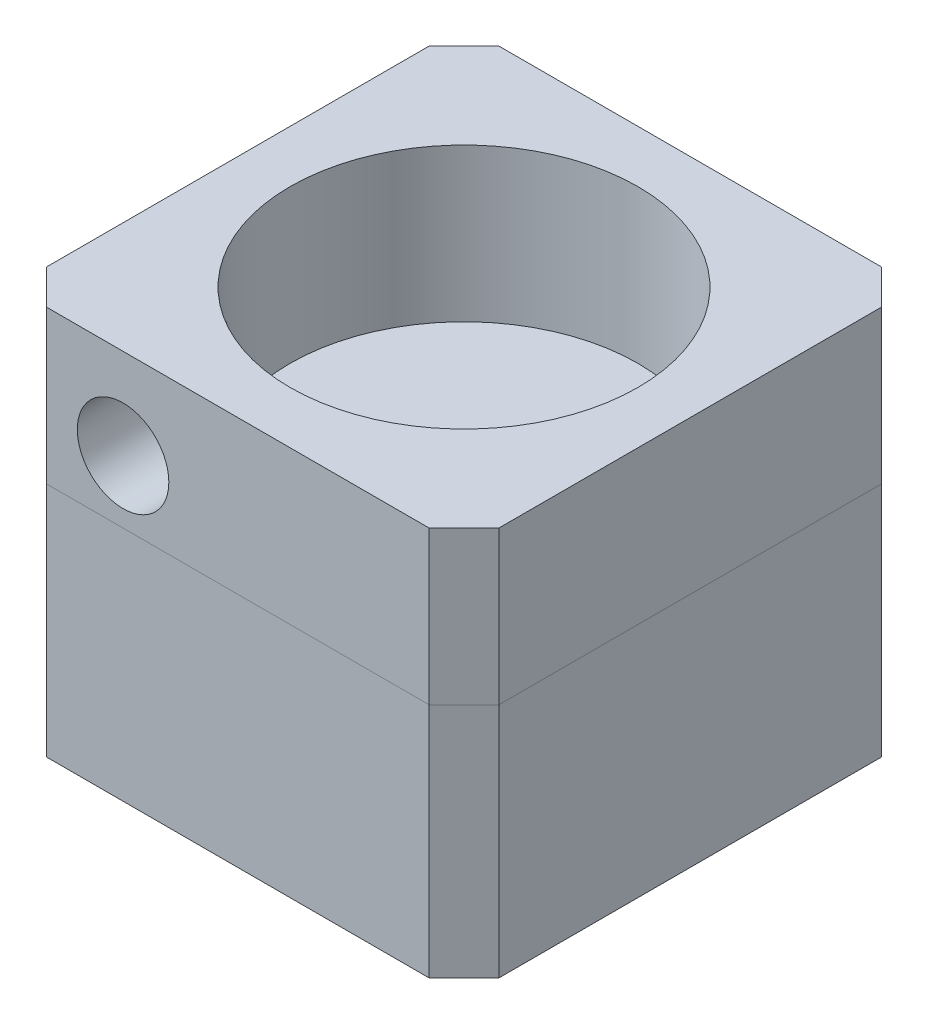
ISO-10303-21;
HEADER;
FILE_DESCRIPTION(('STEP AP214'),'2;1');
FILE_NAME('part.step','',(''),(''),'','','');
FILE_SCHEMA(('AUTOMOTIVE_DESIGN { 1 0 10303 214 1 1 1 1 }'));
ENDSEC;
DATA;
#1=APPLICATION_CONTEXT('core data for automotive mechanical design processes');
#2=APPLICATION_PROTOCOL_DEFINITION('international standard','automotive_design',2000,#1);
#3=PRODUCT_CONTEXT('',#1,'mechanical');
#4=PRODUCT('Part','Part','',(#3));
#5=PRODUCT_RELATED_PRODUCT_CATEGORY('part','',(#4));
#6=PRODUCT_DEFINITION_FORMATION('','',#4);
#7=PRODUCT_DEFINITION_CONTEXT('part definition',#1,'design');
#8=PRODUCT_DEFINITION('design','',#6,#7);
#9=PRODUCT_DEFINITION_SHAPE('','',#8);
#10=(LENGTH_UNIT() NAMED_UNIT(*) SI_UNIT(.MILLI.,.METRE.));
#11=(NAMED_UNIT(*) PLANE_ANGLE_UNIT() SI_UNIT($,.RADIAN.));
#12=(NAMED_UNIT(*) SI_UNIT($,.STERADIAN.) SOLID_ANGLE_UNIT());
#13=UNCERTAINTY_MEASURE_WITH_UNIT(LENGTH_MEASURE(1.E-05),#10,'distance_accuracy_value','');
#14=(GEOMETRIC_REPRESENTATION_CONTEXT(3) GLOBAL_UNCERTAINTY_ASSIGNED_CONTEXT((#13)) GLOBAL_UNIT_ASSIGNED_CONTEXT((#10,
#11,#12)) REPRESENTATION_CONTEXT('',''));
#15=CARTESIAN_POINT('',(0.,0.,0.));
#16=DIRECTION('',(0.,0.,1.));
#17=DIRECTION('',(1.,0.,0.));
#18=AXIS2_PLACEMENT_3D('',#15,#16,#17);
#19=CARTESIAN_POINT('',(32.5,56.,-27.5));
#20=DIRECTION('',(-0.70710678118655,0.,0.707106781186546));
#21=DIRECTION('',(0.707106781186546,0.,0.70710678118655));
#22=AXIS2_PLACEMENT_3D('',#19,#20,#21);
#23=PLANE('',#22);
#24=DIRECTION('',(-0.707106781186545,0.,-0.707106781186549));
#25=VECTOR('',#24,1.);
#26=CARTESIAN_POINT('',(32.5,34.,-27.5));
#27=LINE('',#26,#25);
#28=CARTESIAN_POINT('',(32.5,34.,-27.5));
#29=VERTEX_POINT('',#28);
#30=CARTESIAN_POINT('',(27.5,34.,-32.5));
#31=VERTEX_POINT('',#30);
#32=EDGE_CURVE('E154',#29,#31,#27,.T.);
#33=ORIENTED_EDGE('',*,*,#32,.T.);
#34=DIRECTION('',(0.,-1.,0.));
#35=VECTOR('',#34,1.);
#36=CARTESIAN_POINT('',(27.5,56.,-32.5));
#37=LINE('',#36,#35);
#38=CARTESIAN_POINT('',(27.5,56.,-32.5));
#39=VERTEX_POINT('',#38);
#40=EDGE_CURVE('E56',#39,#31,#37,.T.);
#41=ORIENTED_EDGE('',*,*,#40,.F.);
#42=DIRECTION('',(-0.707106781186545,0.,-0.707106781186549));
#43=VECTOR('',#42,1.);
#44=CARTESIAN_POINT('',(32.5,56.,-27.5));
#45=LINE('',#44,#43);
#46=CARTESIAN_POINT('',(32.5,56.,-27.5));
#47=VERTEX_POINT('',#46);
#48=EDGE_CURVE('E170',#47,#39,#45,.T.);
#49=ORIENTED_EDGE('',*,*,#48,.F.);
#50=DIRECTION('',(0.,-1.,0.));
#51=VECTOR('',#50,1.);
#52=CARTESIAN_POINT('',(32.5,56.,-27.5));
#53=LINE('',#52,#51);
#54=EDGE_CURVE('E150',#47,#29,#53,.T.);
#55=ORIENTED_EDGE('',*,*,#54,.T.);
#56=EDGE_LOOP('',(#33,#41,#49,#55));
#57=FACE_BOUND('',#56,.T.);
#58=ADVANCED_FACE('F49',(#57),#23,.F.);
#59=CARTESIAN_POINT('',(27.5,56.,-32.5));
#60=DIRECTION('',(0.,0.,1.));
#61=DIRECTION('',(1.,0.,0.));
#62=AXIS2_PLACEMENT_3D('',#59,#60,#61);
#63=PLANE('',#62);
#64=DIRECTION('',(-1.,0.,0.));
#65=VECTOR('',#64,1.);
#66=CARTESIAN_POINT('',(27.5,34.,-32.5));
#67=LINE('',#66,#65);
#68=CARTESIAN_POINT('',(-27.5,34.,-32.5));
#69=VERTEX_POINT('',#68);
#70=EDGE_CURVE('E157',#31,#69,#67,.T.);
#71=ORIENTED_EDGE('',*,*,#70,.T.);
#72=DIRECTION('',(0.,-1.,0.));
#73=VECTOR('',#72,1.);
#74=CARTESIAN_POINT('',(-27.5,56.,-32.5));
#75=LINE('',#74,#73);
#76=CARTESIAN_POINT('',(-27.5,56.,-32.5));
#77=VERTEX_POINT('',#76);
#78=EDGE_CURVE('E180',#77,#69,#75,.T.);
#79=ORIENTED_EDGE('',*,*,#78,.F.);
#80=DIRECTION('',(-1.,0.,0.));
#81=VECTOR('',#80,1.);
#82=CARTESIAN_POINT('',(27.5,56.,-32.5));
#83=LINE('',#82,#81);
#84=EDGE_CURVE('E112',#39,#77,#83,.T.);
#85=ORIENTED_EDGE('',*,*,#84,.F.);
#86=ORIENTED_EDGE('',*,*,#40,.T.);
#87=EDGE_LOOP('',(#71,#79,#85,#86));
#88=FACE_BOUND('',#87,.T.);
#89=ADVANCED_FACE('F183',(#88),#63,.F.);
#90=CARTESIAN_POINT('',(-27.5,56.,-32.5));
#91=DIRECTION('',(0.707106781186546,0.,0.70710678118655));
#92=DIRECTION('',(0.70710678118655,0.,-0.707106781186546));
#93=AXIS2_PLACEMENT_3D('',#90,#91,#92);
#94=PLANE('',#93);
#95=DIRECTION('',(-0.707106781186549,0.,0.707106781186545));
#96=VECTOR('',#95,1.);
#97=CARTESIAN_POINT('',(-27.5,34.,-32.5));
#98=LINE('',#97,#96);
#99=CARTESIAN_POINT('',(-32.5,34.,-27.5));
#100=VERTEX_POINT('',#99);
#101=EDGE_CURVE('E160',#69,#100,#98,.T.);
#102=ORIENTED_EDGE('',*,*,#101,.T.);
#103=DIRECTION('',(0.,-1.,0.));
#104=VECTOR('',#103,1.);
#105=CARTESIAN_POINT('',(-32.5,56.,-27.5));
#106=LINE('',#105,#104);
#107=CARTESIAN_POINT('',(-32.5,56.,-27.5));
#108=VERTEX_POINT('',#107);
#109=EDGE_CURVE('E177',#108,#100,#106,.T.);
#110=ORIENTED_EDGE('',*,*,#109,.F.);
#111=DIRECTION('',(-0.707106781186549,0.,0.707106781186545));
#112=VECTOR('',#111,1.);
#113=CARTESIAN_POINT('',(-27.5,56.,-32.5));
#114=LINE('',#113,#112);
#115=EDGE_CURVE('E201',#77,#108,#114,.T.);
#116=ORIENTED_EDGE('',*,*,#115,.F.);
#117=ORIENTED_EDGE('',*,*,#78,.T.);
#118=EDGE_LOOP('',(#102,#110,#116,#117));
#119=FACE_BOUND('',#118,.T.);
#120=ADVANCED_FACE('F194',(#119),#94,.F.);
#121=CARTESIAN_POINT('',(-32.5,56.,-27.5));
#122=DIRECTION('',(1.,0.,0.));
#123=DIRECTION('',(0.,0.,-1.));
#124=AXIS2_PLACEMENT_3D('',#121,#122,#123);
#125=PLANE('',#124);
#126=DIRECTION('',(0.,0.,1.));
#127=VECTOR('',#126,1.);
#128=CARTESIAN_POINT('',(-32.5,34.,-27.5));
#129=LINE('',#128,#127);
#130=CARTESIAN_POINT('',(-32.5,34.,27.5));
#131=VERTEX_POINT('',#130);
#132=EDGE_CURVE('E162',#100,#131,#129,.T.);
#133=ORIENTED_EDGE('',*,*,#132,.T.);
#134=DIRECTION('',(0.,-1.,0.));
#135=VECTOR('',#134,1.);
#136=CARTESIAN_POINT('',(-32.5,56.,27.5));
#137=LINE('',#136,#135);
#138=CARTESIAN_POINT('',(-32.5,56.,27.5));
#139=VERTEX_POINT('',#138);
#140=EDGE_CURVE('E174',#139,#131,#137,.T.);
#141=ORIENTED_EDGE('',*,*,#140,.F.);
#142=DIRECTION('',(0.,0.,1.));
#143=VECTOR('',#142,1.);
#144=CARTESIAN_POINT('',(-32.5,56.,-27.5));
#145=LINE('',#144,#143);
#146=EDGE_CURVE('E200',#108,#139,#145,.T.);
#147=ORIENTED_EDGE('',*,*,#146,.F.);
#148=ORIENTED_EDGE('',*,*,#109,.T.);
#149=EDGE_LOOP('',(#133,#141,#147,#148));
#150=FACE_BOUND('',#149,.T.);
#151=ADVANCED_FACE('F198',(#150),#125,.F.);
#152=CARTESIAN_POINT('',(-32.5,56.,27.5));
#153=DIRECTION('',(0.70710678118655,0.,-0.707106781186546));
#154=DIRECTION('',(-0.707106781186546,0.,-0.70710678118655));
#155=AXIS2_PLACEMENT_3D('',#152,#153,#154);
#156=PLANE('',#155);
#157=DIRECTION('',(0.707106781186545,0.,0.707106781186549));
#158=VECTOR('',#157,1.);
#159=CARTESIAN_POINT('',(-32.5,34.,27.5));
#160=LINE('',#159,#158);
#161=CARTESIAN_POINT('',(-27.5,34.,32.5));
#162=VERTEX_POINT('',#161);
#163=EDGE_CURVE('E164',#131,#162,#160,.T.);
#164=ORIENTED_EDGE('',*,*,#163,.T.);
#165=DIRECTION('',(0.,-1.,0.));
#166=VECTOR('',#165,1.);
#167=CARTESIAN_POINT('',(-27.5,56.,32.5));
#168=LINE('',#167,#166);
#169=CARTESIAN_POINT('',(-27.5,56.,32.5));
#170=VERTEX_POINT('',#169);
#171=EDGE_CURVE('E145',#170,#162,#168,.T.);
#172=ORIENTED_EDGE('',*,*,#171,.F.);
#173=DIRECTION('',(0.707106781186545,0.,0.707106781186549));
#174=VECTOR('',#173,1.);
#175=CARTESIAN_POINT('',(-32.5,56.,27.5));
#176=LINE('',#175,#174);
#177=EDGE_CURVE('E133',#139,#170,#176,.T.);
#178=ORIENTED_EDGE('',*,*,#177,.F.);
#179=ORIENTED_EDGE('',*,*,#140,.T.);
#180=EDGE_LOOP('',(#164,#172,#178,#179));
#181=FACE_BOUND('',#180,.T.);
#182=ADVANCED_FACE('F248',(#181),#156,.F.);
#183=CARTESIAN_POINT('',(-27.5,56.,32.5));
#184=DIRECTION('',(0.,0.,-1.));
#185=DIRECTION('',(-1.,0.,0.));
#186=AXIS2_PLACEMENT_3D('',#183,#184,#185);
#187=PLANE('',#186);
#188=CARTESIAN_POINT('',(-16.5,43.,32.5));
#189=DIRECTION('',(0.,0.,1.));
#190=DIRECTION('',(1.,0.,0.));
#191=AXIS2_PLACEMENT_3D('',#188,#189,#190);
#192=CIRCLE('',#191,6.5785);
#193=CARTESIAN_POINT('',(-9.9215,43.,32.5));
#194=VERTEX_POINT('',#193);
#195=EDGE_CURVE('E207',#194,#194,#192,.T.);
#196=ORIENTED_EDGE('',*,*,#195,.F.);
#197=EDGE_LOOP('',(#196));
#198=FACE_BOUND('',#197,.T.);
#199=DIRECTION('',(1.,0.,0.));
#200=VECTOR('',#199,1.);
#201=CARTESIAN_POINT('',(-27.5,34.,32.5));
#202=LINE('',#201,#200);
#203=CARTESIAN_POINT('',(27.5,34.,32.5));
#204=VERTEX_POINT('',#203);
#205=EDGE_CURVE('E142',#162,#204,#202,.T.);
#206=ORIENTED_EDGE('',*,*,#205,.T.);
#207=DIRECTION('',(0.,-1.,0.));
#208=VECTOR('',#207,1.);
#209=CARTESIAN_POINT('',(27.5,56.,32.5));
#210=LINE('',#209,#208);
#211=CARTESIAN_POINT('',(27.5,56.,32.5));
#212=VERTEX_POINT('',#211);
#213=EDGE_CURVE('E139',#212,#204,#210,.T.);
#214=ORIENTED_EDGE('',*,*,#213,.F.);
#215=DIRECTION('',(1.,0.,0.));
#216=VECTOR('',#215,1.);
#217=CARTESIAN_POINT('',(-27.5,56.,32.5));
#218=LINE('',#217,#216);
#219=EDGE_CURVE('E126',#170,#212,#218,.T.);
#220=ORIENTED_EDGE('',*,*,#219,.F.);
#221=ORIENTED_EDGE('',*,*,#171,.T.);
#222=EDGE_LOOP('',(#206,#214,#220,#221));
#223=FACE_BOUND('',#222,.T.);
#224=ADVANCED_FACE('F140',(#198,#223),#187,.F.);
#225=CARTESIAN_POINT('',(27.5,56.,32.5));
#226=DIRECTION('',(-0.707106781186546,0.,-0.70710678118655));
#227=DIRECTION('',(-0.70710678118655,0.,0.707106781186546));
#228=AXIS2_PLACEMENT_3D('',#225,#226,#227);
#229=PLANE('',#228);
#230=DIRECTION('',(0.707106781186549,0.,-0.707106781186545));
#231=VECTOR('',#230,1.);
#232=CARTESIAN_POINT('',(27.5,34.,32.5));
#233=LINE('',#232,#231);
#234=CARTESIAN_POINT('',(32.5,34.,27.5));
#235=VERTEX_POINT('',#234);
#236=EDGE_CURVE('E167',#204,#235,#233,.T.);
#237=ORIENTED_EDGE('',*,*,#236,.T.);
#238=DIRECTION('',(0.,-1.,0.));
#239=VECTOR('',#238,1.);
#240=CARTESIAN_POINT('',(32.5,56.,27.5));
#241=LINE('',#240,#239);
#242=CARTESIAN_POINT('',(32.5,56.,27.5));
#243=VERTEX_POINT('',#242);
#244=EDGE_CURVE('E146',#243,#235,#241,.T.);
#245=ORIENTED_EDGE('',*,*,#244,.F.);
#246=DIRECTION('',(0.707106781186549,0.,-0.707106781186545));
#247=VECTOR('',#246,1.);
#248=CARTESIAN_POINT('',(27.5,56.,32.5));
#249=LINE('',#248,#247);
#250=EDGE_CURVE('E130',#212,#243,#249,.T.);
#251=ORIENTED_EDGE('',*,*,#250,.F.);
#252=ORIENTED_EDGE('',*,*,#213,.T.);
#253=EDGE_LOOP('',(#237,#245,#251,#252));
#254=FACE_BOUND('',#253,.T.);
#255=ADVANCED_FACE('F148',(#254),#229,.F.);
#256=CARTESIAN_POINT('',(32.5,56.,27.5));
#257=DIRECTION('',(-1.,0.,0.));
#258=DIRECTION('',(0.,0.,1.));
#259=AXIS2_PLACEMENT_3D('',#256,#257,#258);
#260=PLANE('',#259);
#261=DIRECTION('',(0.,0.,-1.));
#262=VECTOR('',#261,1.);
#263=CARTESIAN_POINT('',(32.5,34.,27.5));
#264=LINE('',#263,#262);
#265=EDGE_CURVE('E103',#235,#29,#264,.T.);
#266=ORIENTED_EDGE('',*,*,#265,.T.);
#267=ORIENTED_EDGE('',*,*,#54,.F.);
#268=DIRECTION('',(0.,0.,-1.));
#269=VECTOR('',#268,1.);
#270=CARTESIAN_POINT('',(32.5,56.,27.5));
#271=LINE('',#270,#269);
#272=EDGE_CURVE('E70',#243,#47,#271,.T.);
#273=ORIENTED_EDGE('',*,*,#272,.F.);
#274=ORIENTED_EDGE('',*,*,#244,.T.);
#275=EDGE_LOOP('',(#266,#267,#273,#274));
#276=FACE_BOUND('',#275,.T.);
#277=ADVANCED_FACE('F257',(#276),#260,.F.);
#278=CARTESIAN_POINT('',(0.,56.,0.));
#279=DIRECTION('',(0.,1.,0.));
#280=DIRECTION('',(0.,0.,1.));
#281=AXIS2_PLACEMENT_3D('',#278,#279,#280);
#282=PLANE('',#281);
#283=CARTESIAN_POINT('',(0.,56.,0.));
#284=DIRECTION('',(0.,1.,0.));
#285=DIRECTION('',(0.,0.,1.));
#286=AXIS2_PLACEMENT_3D('',#283,#284,#285);
#287=CIRCLE('',#286,25.);
#288=CARTESIAN_POINT('',(0.,56.,25.));
#289=VERTEX_POINT('',#288);
#290=EDGE_CURVE('E220',#289,#289,#287,.T.);
#291=ORIENTED_EDGE('',*,*,#290,.F.);
#292=EDGE_LOOP('',(#291));
#293=FACE_BOUND('',#292,.T.);
#294=ORIENTED_EDGE('',*,*,#48,.T.);
#295=ORIENTED_EDGE('',*,*,#84,.T.);
#296=ORIENTED_EDGE('',*,*,#115,.T.);
#297=ORIENTED_EDGE('',*,*,#146,.T.);
#298=ORIENTED_EDGE('',*,*,#177,.T.);
#299=ORIENTED_EDGE('',*,*,#219,.T.);
#300=ORIENTED_EDGE('',*,*,#250,.T.);
#301=ORIENTED_EDGE('',*,*,#272,.T.);
#302=EDGE_LOOP('',(#294,#295,#296,#297,#298,#299,#300,#301));
#303=FACE_BOUND('',#302,.T.);
#304=ADVANCED_FACE('F128',(#293,#303),#282,.T.);
#305=CARTESIAN_POINT('',(0.,34.,0.));
#306=DIRECTION('',(0.,1.,0.));
#307=DIRECTION('',(0.,0.,1.));
#308=AXIS2_PLACEMENT_3D('',#305,#306,#307);
#309=PLANE('',#308);
#310=CARTESIAN_POINT('',(0.,34.,0.));
#311=DIRECTION('',(0.,1.,0.));
#312=DIRECTION('',(0.,0.,1.));
#313=AXIS2_PLACEMENT_3D('',#310,#311,#312);
#314=CIRCLE('',#313,25.);
#315=CARTESIAN_POINT('',(0.,34.,25.));
#316=VERTEX_POINT('',#315);
#317=EDGE_CURVE('E219',#316,#316,#314,.T.);
#318=ORIENTED_EDGE('',*,*,#317,.T.);
#319=EDGE_LOOP('',(#318));
#320=FACE_BOUND('',#319,.T.);
#321=ORIENTED_EDGE('',*,*,#32,.F.);
#322=ORIENTED_EDGE('',*,*,#265,.F.);
#323=ORIENTED_EDGE('',*,*,#236,.F.);
#324=ORIENTED_EDGE('',*,*,#205,.F.);
#325=ORIENTED_EDGE('',*,*,#163,.F.);
#326=ORIENTED_EDGE('',*,*,#132,.F.);
#327=ORIENTED_EDGE('',*,*,#101,.F.);
#328=ORIENTED_EDGE('',*,*,#70,.F.);
#329=EDGE_LOOP('',(#321,#322,#323,#324,#325,#326,#327,#328));
#330=FACE_BOUND('',#329,.T.);
#331=ADVANCED_FACE('F188',(#320,#330),#309,.F.);
#332=CARTESIAN_POINT('',(-16.5,43.,12.5));
#333=DIRECTION('',(0.,0.,1.));
#334=DIRECTION('',(1.,0.,0.));
#335=AXIS2_PLACEMENT_3D('',#332,#333,#334);
#336=CYLINDRICAL_SURFACE('',#335,6.5785);
#337=CARTESIAN_POINT('',(-16.5,43.,12.5));
#338=DIRECTION('',(0.,0.,1.));
#339=DIRECTION('',(1.,0.,0.));
#340=AXIS2_PLACEMENT_3D('',#337,#338,#339);
#341=CIRCLE('',#340,6.5785);
#342=CARTESIAN_POINT('',(-21.650635094611,47.0923856577994,12.5));
#343=VERTEX_POINT('',#342);
#344=CARTESIAN_POINT('',(-21.650635094611,38.9076143422006,12.5));
#345=VERTEX_POINT('',#344);
#346=EDGE_CURVE('E158',#343,#345,#341,.T.);
#347=ORIENTED_EDGE('',*,*,#346,.F.);
#348=CARTESIAN_POINT('',(-21.650635094611,47.0923856577994,12.5));
#349=CARTESIAN_POINT('',(-21.5637259693581,47.2017267637698,12.65054526123));
#350=CARTESIAN_POINT('',(-21.4740997534811,47.3074196209437,12.8021427833464));
#351=CARTESIAN_POINT('',(-21.2895190935481,47.5117864652389,13.106792029322));
#352=CARTESIAN_POINT('',(-21.1945652235791,47.6104612060163,13.2598435950283));
#353=CARTESIAN_POINT('',(-20.9993563201292,47.8011516006098,13.5668778745944));
#354=CARTESIAN_POINT('',(-20.8990980546609,47.8931631117135,13.7208611043233));
#355=CARTESIAN_POINT('',(-20.6933958199868,48.0705559740966,14.0291740901187));
#356=CARTESIAN_POINT('',(-20.5879516630355,48.1559370850455,14.1835038585377));
#357=CARTESIAN_POINT('',(-20.2619538519619,48.4036447152072,14.6491487076248));
#358=CARTESIAN_POINT('',(-20.0334605276588,48.555850803564,14.960390532363));
#359=CARTESIAN_POINT('',(-19.5559278169288,48.8321521063769,15.5794249630875));
#360=CARTESIAN_POINT('',(-19.306894847448,48.9562560553923,15.8872186124673));
#361=CARTESIAN_POINT('',(-18.8448595040399,49.150344982249,16.4307501091324));
#362=CARTESIAN_POINT('',(-18.6357183129589,49.2262296249778,16.6676703726288));
#363=CARTESIAN_POINT('',(-18.20559666233,49.3575276941481,17.1364345688838));
#364=CARTESIAN_POINT('',(-17.9846167784676,49.4129421149717,17.3682787477086));
#365=CARTESIAN_POINT('',(-17.5322984727929,49.5010730278469,17.8247423212731));
#366=CARTESIAN_POINT('',(-17.3009934692148,49.5338577917371,18.0493814800977));
#367=CARTESIAN_POINT('',(-16.8286577240932,49.5745569563417,18.4905543364434));
#368=CARTESIAN_POINT('',(-16.5876296403351,49.5824781074413,18.7070902181987));
#369=CARTESIAN_POINT('',(-16.1571564217152,49.5721807008193,19.0789535990572));
#370=CARTESIAN_POINT('',(-15.9693805149651,49.5598366207306,19.2363876936061));
#371=CARTESIAN_POINT('',(-15.5904378663003,49.5181038101346,19.5447657673425));
#372=CARTESIAN_POINT('',(-15.3992718861999,49.4887188631406,19.6957111791972));
#373=CARTESIAN_POINT('',(-15.0150627588723,49.4117068542369,19.9901584486391));
#374=CARTESIAN_POINT('',(-14.8220209273305,49.3640917889637,20.1336651310433));
#375=CARTESIAN_POINT('',(-14.4357117436636,49.249475678144,20.4124207338638));
#376=CARTESIAN_POINT('',(-14.2424444321512,49.1824777076929,20.5476709600473));
#377=CARTESIAN_POINT('',(-13.8902833836667,49.0411686197638,20.786953122697));
#378=CARTESIAN_POINT('',(-13.731090199381,48.9699970468118,20.8924028506378));
#379=CARTESIAN_POINT('',(-13.4154703628897,48.8132069213302,21.0964557864745));
#380=CARTESIAN_POINT('',(-13.259043171063,48.7275912218599,21.1950603410367));
#381=CARTESIAN_POINT('',(-12.9505236239848,48.5416885195174,21.3849655915));
#382=CARTESIAN_POINT('',(-12.7984310481368,48.441402264855,21.4762666595175));
#383=CARTESIAN_POINT('',(-12.5002846535348,48.2261592726595,21.6511606211253));
#384=CARTESIAN_POINT('',(-12.3542309321796,48.111202298629,21.7347533904176));
#385=CARTESIAN_POINT('',(-12.0691051098146,47.8661463269331,21.8943728628726));
#386=CARTESIAN_POINT('',(-11.9300807450282,47.7359596897377,21.9703505831264));
#387=CARTESIAN_POINT('',(-11.6618364202686,47.4615740218274,22.1139033457748));
#388=CARTESIAN_POINT('',(-11.5326166753636,47.3173746838966,22.1814782038701));
#389=CARTESIAN_POINT('',(-11.2858542554602,47.0158788713959,22.3080417348163));
#390=CARTESIAN_POINT('',(-11.1683082221617,46.8585861876027,22.3670328793199));
#391=CARTESIAN_POINT('',(-10.9465909807253,46.5320314888372,22.476375033669));
#392=CARTESIAN_POINT('',(-10.8424182387765,46.3627708499542,22.5267270345793));
#393=CARTESIAN_POINT('',(-10.6594862120543,46.0326111842522,22.6138117097655));
#394=CARTESIAN_POINT('',(-10.579196612006,45.8727905308118,22.6514286589357));
#395=CARTESIAN_POINT('',(-10.4314634242465,45.545915609453,22.7198415993828));
#396=CARTESIAN_POINT('',(-10.3640190801548,45.3788617681655,22.7506379922989));
#397=CARTESIAN_POINT('',(-10.242814730183,45.0388390814241,22.8054636880555));
#398=CARTESIAN_POINT('',(-10.1890509043511,44.8658719024615,22.8294948801135));
#399=CARTESIAN_POINT('',(-10.0958378832563,44.5153402850042,22.8708693074652));
#400=CARTESIAN_POINT('',(-10.0563883214067,44.3377759643665,22.8882127140332));
#401=CARTESIAN_POINT('',(-9.99407454433805,43.9895056859148,22.9154873880578));
#402=CARTESIAN_POINT('',(-9.9704065236849,43.8189711544348,22.9257787798844));
#403=CARTESIAN_POINT('',(-9.93650895267952,43.4763228882906,22.9404911384882));
#404=CARTESIAN_POINT('',(-9.9262789494282,43.3042092070451,22.9449123031086));
#405=CARTESIAN_POINT('',(-9.91936780270951,42.9596840114038,22.9479009140981));
#406=CARTESIAN_POINT('',(-9.92268478018147,42.7872725416294,22.946469172306));
#407=CARTESIAN_POINT('',(-9.94282753364615,42.4433886371846,22.937748381342));
#408=CARTESIAN_POINT('',(-9.95965332921436,42.2719162038754,22.9304593236823));
#409=CARTESIAN_POINT('',(-10.0062967766106,41.9335926909877,22.910143165655));
#410=CARTESIAN_POINT('',(-10.0359259292019,41.7667105757285,22.8971992898427));
#411=CARTESIAN_POINT('',(-10.1078344924709,41.4361921954325,22.8655466513348));
#412=CARTESIAN_POINT('',(-10.1501181839944,41.2725570488039,22.8468359377381));
#413=CARTESIAN_POINT('',(-10.2468746801241,40.9497637516779,22.803604170795));
#414=CARTESIAN_POINT('',(-10.3013445565946,40.7906045360141,22.7790845131572));
#415=CARTESIAN_POINT('',(-10.4219060415785,40.4777918114367,22.7241778386028));
#416=CARTESIAN_POINT('',(-10.4879980627668,40.324138498258,22.6937906133391));
#417=CARTESIAN_POINT('',(-10.6316939383233,40.0221076410931,22.6268295295282));
#418=CARTESIAN_POINT('',(-10.7093878632188,39.8737837779462,22.5902069197175));
#419=CARTESIAN_POINT('',(-10.8750529932344,39.5846828819071,22.5109229210707));
#420=CARTESIAN_POINT('',(-10.9630244236019,39.4439060145176,22.4682613998782));
#421=CARTESIAN_POINT('',(-11.148300959501,39.1707426676358,22.3769087949658));
#422=CARTESIAN_POINT('',(-11.2456044607778,39.0383547524934,22.3282187471786));
#423=CARTESIAN_POINT('',(-11.4485878326687,38.7825880573206,22.2248242033265));
#424=CARTESIAN_POINT('',(-11.5542706353319,38.6592124601142,22.170117599359));
#425=CARTESIAN_POINT('',(-11.7769907520796,38.4176614907855,22.0526396951115));
#426=CARTESIAN_POINT('',(-11.8943040692435,38.2998497372082,21.9896442495488));
#427=CARTESIAN_POINT('',(-12.1356003092767,38.0749731970075,21.8574046313326));
#428=CARTESIAN_POINT('',(-12.2595856528837,37.9679123519483,21.7881581844393));
#429=CARTESIAN_POINT('',(-12.5129541885084,37.7648802195417,21.6436420309844));
#430=CARTESIAN_POINT('',(-12.6423365167864,37.6689071668883,21.5683732864816));
#431=CARTESIAN_POINT('',(-12.9053801573233,37.4881171235948,21.4120196008003));
#432=CARTESIAN_POINT('',(-13.039043015817,37.4033042221099,21.3309325444762));
#433=CARTESIAN_POINT('',(-13.3215977743161,37.2377453446466,21.1557338134857));
#434=CARTESIAN_POINT('',(-13.4707815439694,37.1580437411911,21.0611060414682));
#435=CARTESIAN_POINT('',(-13.771550077154,37.0116602418445,20.8656797625541));
#436=CARTESIAN_POINT('',(-13.92313578781,36.9449836273719,20.7648787741906));
#437=CARTESIAN_POINT('',(-14.2274542349154,36.824322528457,20.5575640550169));
#438=CARTESIAN_POINT('',(-14.3801870684672,36.770339131265,20.4510498357932));
#439=CARTESIAN_POINT('',(-14.685735973991,36.6745946603484,20.2327567425246));
#440=CARTESIAN_POINT('',(-14.8385520564907,36.6328360273377,20.1209768223301));
#441=CARTESIAN_POINT('',(-15.2116361558372,36.5449109086412,19.8414230915757));
#442=CARTESIAN_POINT('',(-15.4314503339672,36.5051515453021,19.6709996527425));
#443=CARTESIAN_POINT('',(-15.8670148445776,36.4483382591557,19.3213852131211));
#444=CARTESIAN_POINT('',(-16.08276373375,36.4312922559679,19.142191176796));
#445=CARTESIAN_POINT('',(-16.5088607109393,36.4180469782278,18.7759577276165));
#446=CARTESIAN_POINT('',(-16.719197182896,36.4218893032067,18.5889033960496));
#447=CARTESIAN_POINT('',(-17.1327364129196,36.4487215964395,18.2084686816628));
#448=CARTESIAN_POINT('',(-17.3359390943673,36.4717117702814,18.0150882309416));
#449=CARTESIAN_POINT('',(-17.8005579667689,36.5457410422931,17.5578671159431));
#450=CARTESIAN_POINT('',(-18.058879556352,36.6035622540704,17.29196671339));
#451=CARTESIAN_POINT('',(-18.5599602092641,36.7469062214394,16.7530119811799));
#452=CARTESIAN_POINT('',(-18.8027131163362,36.8324398553104,16.4799548809715));
#453=CARTESIAN_POINT('',(-19.2719158698265,37.0285820300118,15.9287264806682));
#454=CARTESIAN_POINT('',(-19.4983583887834,37.1392017493563,15.6505529515944));
#455=CARTESIAN_POINT('',(-19.9343566917839,37.3835675005872,15.0912911929755));
#456=CARTESIAN_POINT('',(-20.143917229035,37.5173069893879,14.8102038091757));
#457=CARTESIAN_POINT('',(-20.4666662101526,37.7497888494944,14.3582559238));
#458=CARTESIAN_POINT('',(-20.5852803454499,37.8415450097804,14.1876228745955));
#459=CARTESIAN_POINT('',(-20.8161646262009,38.0331218401438,13.846648192635));
#460=CARTESIAN_POINT('',(-20.9284362823644,38.1329405759221,13.6763064999348));
#461=CARTESIAN_POINT('',(-21.14609985098,38.340284363449,13.3372717590872));
#462=CARTESIAN_POINT('',(-21.2515203167978,38.4477729088018,13.1685747441423));
#463=CARTESIAN_POINT('',(-21.4559372690046,38.6712408768248,12.832830345739));
#464=CARTESIAN_POINT('',(-21.5549317245295,38.7872229593679,12.6657834978014));
#465=CARTESIAN_POINT('',(-21.650635094611,38.9076143422006,12.5));
#466=B_SPLINE_CURVE_WITH_KNOTS('',3,(#348,#349,#350,#351,#352,#353,#354,#355,#356,#357,#358,
#359,#360,#361,#362,#363,#364,#365,#366,#367,#368,#369,#370,#371,#372,#373,#374,#375,#376,#377,
#378,#379,#380,#381,#382,#383,#384,#385,#386,#387,#388,#389,#390,#391,#392,#393,#394,#395,#396,
#397,#398,#399,#400,#401,#402,#403,#404,#405,#406,#407,#408,#409,#410,#411,#412,#413,#414,#415,
#416,#417,#418,#419,#420,#421,#422,#423,#424,#425,#426,#427,#428,#429,#430,#431,#432,#433,#434,
#435,#436,#437,#438,#439,#440,#441,#442,#443,#444,#445,#446,#447,#448,#449,#450,#451,#452,#453,
#454,#455,#456,#457,#458,#459,#460,#461,#462,#463,#464,#465),.UNSPECIFIED.,.F.,.F.,(4,2,2,2,2,2,
2,2,2,2,2,2,2,2,2,2,2,2,2,2,2,2,2,2,2,2,2,2,2,2,2,2,2,2,2,2,2,2,2,2,2,2,2,2,2,2,2,2,2,2,2,2,2,2,
2,2,2,2,4),(0.,0.615993778402678,1.23192130674057,1.84822854364578,2.46455810926121,
3.70810986280523,4.95127456996916,5.92548344080185,6.89964498125654,7.8708545565827,
8.84180042903528,9.57723046623448,10.3124972814222,11.0472810712368,11.7819483515599,
12.3926999736379,13.0033310986599,13.6139310918664,14.2245409294154,14.8388555262979,
15.4531835945138,16.0673344173913,16.6814147389687,17.2290184527637,17.7765899114625,
18.3240083059617,18.8714126801443,19.3882190857156,19.9050080730058,20.4217253804951,
20.9384434367558,21.4478002323787,21.9573295311137,22.4667365297555,22.9761616198937,
23.4897697373988,24.00338911353,24.516920352271,25.0306320834895,25.5634338096373,
26.0964301670752,26.629341547982,27.1624476507262,27.7432947202771,28.3243768270817,
28.9055086889454,29.4867564966705,30.3284159243206,31.1703687422759,32.0139989399048,
32.8576381956017,33.9816258244276,35.1060552008266,36.2309866178647,37.3556001896696,
38.0368941446084,38.7180251325027,39.3961063406132,40.0744008152269),.UNSPECIFIED.);
#467=EDGE_CURVE('E61',#343,#345,#466,.T.);
#468=ORIENTED_EDGE('',*,*,#467,.T.);
#469=EDGE_LOOP('',(#347,#468));
#470=FACE_BOUND('',#469,.T.);
#471=ORIENTED_EDGE('',*,*,#195,.T.);
#472=EDGE_LOOP('',(#471));
#473=FACE_BOUND('',#472,.T.);
#474=ADVANCED_FACE('F222',(#470,#473),#336,.F.);
#475=CARTESIAN_POINT('',(-16.5,43.,12.5));
#476=DIRECTION('',(0.,0.,1.));
#477=DIRECTION('',(1.,0.,0.));
#478=AXIS2_PLACEMENT_3D('',#475,#476,#477);
#479=PLANE('',#478);
#480=DIRECTION('',(0.,1.,0.));
#481=VECTOR('',#480,1.);
#482=CARTESIAN_POINT('',(-21.650635094611,34.,12.5));
#483=LINE('',#482,#481);
#484=EDGE_CURVE('E12',#343,#345,#483,.F.);
#485=ORIENTED_EDGE('',*,*,#484,.F.);
#486=ORIENTED_EDGE('',*,*,#346,.T.);
#487=EDGE_LOOP('',(#485,#486));
#488=FACE_BOUND('',#487,.T.);
#489=ADVANCED_FACE('F229',(#488),#479,.T.);
#490=CARTESIAN_POINT('',(0.,34.,0.));
#491=DIRECTION('',(0.,1.,0.));
#492=DIRECTION('',(0.,0.,1.));
#493=AXIS2_PLACEMENT_3D('',#490,#491,#492);
#494=CYLINDRICAL_SURFACE('',#493,25.);
#495=ORIENTED_EDGE('',*,*,#317,.F.);
#496=EDGE_LOOP('',(#495));
#497=FACE_BOUND('',#496,.T.);
#498=ORIENTED_EDGE('',*,*,#290,.T.);
#499=EDGE_LOOP('',(#498));
#500=FACE_BOUND('',#499,.T.);
#501=ORIENTED_EDGE('',*,*,#484,.T.);
#502=ORIENTED_EDGE('',*,*,#467,.F.);
#503=EDGE_LOOP('',(#501,#502));
#504=FACE_BOUND('',#503,.T.);
#505=ADVANCED_FACE('F226',(#497,#500,#504),#494,.F.);
#506=CLOSED_SHELL('',(#58,#89,#120,#151,#182,#224,#255,#277,#304,#331,#474,#489,#505));
#507=MANIFOLD_SOLID_BREP('B2',#506);
#508=CARTESIAN_POINT('',(-32.5,34.,32.5));
#509=DIRECTION('',(0.,0.,-1.));
#510=DIRECTION('',(-1.,0.,0.));
#511=AXIS2_PLACEMENT_3D('',#508,#509,#510);
#512=PLANE('',#511);
#513=DIRECTION('',(1.,0.,0.));
#514=VECTOR('',#513,1.);
#515=CARTESIAN_POINT('',(-32.5,0.,32.5));
#516=LINE('',#515,#514);
#517=CARTESIAN_POINT('',(-27.5,0.,32.5));
#518=VERTEX_POINT('',#517);
#519=CARTESIAN_POINT('',(27.5,0.,32.5));
#520=VERTEX_POINT('',#519);
#521=EDGE_CURVE('E456',#518,#520,#516,.T.);
#522=ORIENTED_EDGE('',*,*,#521,.T.);
#523=DIRECTION('',(0.,1.,0.));
#524=VECTOR('',#523,1.);
#525=CARTESIAN_POINT('',(27.5,34.,32.5));
#526=LINE('',#525,#524);
#527=CARTESIAN_POINT('',(27.5,34.,32.5));
#528=VERTEX_POINT('',#527);
#529=EDGE_CURVE('E47',#520,#528,#526,.T.);
#530=ORIENTED_EDGE('',*,*,#529,.T.);
#531=DIRECTION('',(1.,0.,0.));
#532=VECTOR('',#531,1.);
#533=CARTESIAN_POINT('',(-32.5,34.,32.5));
#534=LINE('',#533,#532);
#535=CARTESIAN_POINT('',(-27.5,34.,32.5));
#536=VERTEX_POINT('',#535);
#537=EDGE_CURVE('E457',#536,#528,#534,.T.);
#538=ORIENTED_EDGE('',*,*,#537,.F.);
#539=DIRECTION('',(0.,-1.,0.));
#540=VECTOR('',#539,1.);
#541=CARTESIAN_POINT('',(-27.5,0.,32.5));
#542=LINE('',#541,#540);
#543=EDGE_CURVE('E355',#536,#518,#542,.T.);
#544=ORIENTED_EDGE('',*,*,#543,.T.);
#545=EDGE_LOOP('',(#522,#530,#538,#544));
#546=FACE_BOUND('',#545,.T.);
#547=ADVANCED_FACE('F347',(#546),#512,.F.);
#548=CARTESIAN_POINT('',(32.5,34.,32.5));
#549=DIRECTION('',(-1.,0.,0.));
#550=DIRECTION('',(0.,0.,1.));
#551=AXIS2_PLACEMENT_3D('',#548,#549,#550);
#552=PLANE('',#551);
#553=DIRECTION('',(0.,0.,-1.));
#554=VECTOR('',#553,1.);
#555=CARTESIAN_POINT('',(32.5,0.,32.5));
#556=LINE('',#555,#554);
#557=CARTESIAN_POINT('',(32.5,0.,27.5));
#558=VERTEX_POINT('',#557);
#559=CARTESIAN_POINT('',(32.5,0.,-27.5));
#560=VERTEX_POINT('',#559);
#561=EDGE_CURVE('E471',#558,#560,#556,.T.);
#562=ORIENTED_EDGE('',*,*,#561,.T.);
#563=DIRECTION('',(0.,1.,0.));
#564=VECTOR('',#563,1.);
#565=CARTESIAN_POINT('',(32.5,34.,-27.5));
#566=LINE('',#565,#564);
#567=CARTESIAN_POINT('',(32.5,34.,-27.5));
#568=VERTEX_POINT('',#567);
#569=EDGE_CURVE('E362',#560,#568,#566,.T.);
#570=ORIENTED_EDGE('',*,*,#569,.T.);
#571=DIRECTION('',(0.,0.,-1.));
#572=VECTOR('',#571,1.);
#573=CARTESIAN_POINT('',(32.5,34.,32.5));
#574=LINE('',#573,#572);
#575=CARTESIAN_POINT('',(32.5,34.,27.5));
#576=VERTEX_POINT('',#575);
#577=EDGE_CURVE('E459',#576,#568,#574,.T.);
#578=ORIENTED_EDGE('',*,*,#577,.F.);
#579=DIRECTION('',(0.,-1.,0.));
#580=VECTOR('',#579,1.);
#581=CARTESIAN_POINT('',(32.5,34.,27.5));
#582=LINE('',#581,#580);
#583=EDGE_CURVE('E502',#576,#558,#582,.T.);
#584=ORIENTED_EDGE('',*,*,#583,.T.);
#585=EDGE_LOOP('',(#562,#570,#578,#584));
#586=FACE_BOUND('',#585,.T.);
#587=ADVANCED_FACE('F520',(#586),#552,.F.);
#588=CARTESIAN_POINT('',(-32.5,34.,-32.5));
#589=DIRECTION('',(0.,0.,-1.));
#590=DIRECTION('',(-1.,0.,0.));
#591=AXIS2_PLACEMENT_3D('',#588,#589,#590);
#592=PLANE('',#591);
#593=DIRECTION('',(1.,0.,0.));
#594=VECTOR('',#593,1.);
#595=CARTESIAN_POINT('',(-32.5,0.,-32.5));
#596=LINE('',#595,#594);
#597=CARTESIAN_POINT('',(-27.5,0.,-32.5));
#598=VERTEX_POINT('',#597);
#599=CARTESIAN_POINT('',(27.5,0.,-32.5));
#600=VERTEX_POINT('',#599);
#601=EDGE_CURVE('E473',#598,#600,#596,.T.);
#602=ORIENTED_EDGE('',*,*,#601,.F.);
#603=DIRECTION('',(0.,1.,0.));
#604=VECTOR('',#603,1.);
#605=CARTESIAN_POINT('',(-27.5,34.,-32.5));
#606=LINE('',#605,#604);
#607=CARTESIAN_POINT('',(-27.5,34.,-32.5));
#608=VERTEX_POINT('',#607);
#609=EDGE_CURVE('E493',#598,#608,#606,.T.);
#610=ORIENTED_EDGE('',*,*,#609,.T.);
#611=DIRECTION('',(1.,0.,0.));
#612=VECTOR('',#611,1.);
#613=CARTESIAN_POINT('',(-32.5,34.,-32.5));
#614=LINE('',#613,#612);
#615=CARTESIAN_POINT('',(27.5,34.,-32.5));
#616=VERTEX_POINT('',#615);
#617=EDGE_CURVE('E462',#608,#616,#614,.T.);
#618=ORIENTED_EDGE('',*,*,#617,.T.);
#619=DIRECTION('',(0.,-1.,0.));
#620=VECTOR('',#619,1.);
#621=CARTESIAN_POINT('',(27.5,0.,-32.5));
#622=LINE('',#621,#620);
#623=EDGE_CURVE('E490',#616,#600,#622,.T.);
#624=ORIENTED_EDGE('',*,*,#623,.T.);
#625=EDGE_LOOP('',(#602,#610,#618,#624));
#626=FACE_BOUND('',#625,.T.);
#627=ADVANCED_FACE('F529',(#626),#592,.T.);
#628=CARTESIAN_POINT('',(-32.5,34.,32.5));
#629=DIRECTION('',(-1.,0.,0.));
#630=DIRECTION('',(0.,0.,1.));
#631=AXIS2_PLACEMENT_3D('',#628,#629,#630);
#632=PLANE('',#631);
#633=DIRECTION('',(0.,0.,-1.));
#634=VECTOR('',#633,1.);
#635=CARTESIAN_POINT('',(-32.5,34.,32.5));
#636=LINE('',#635,#634);
#637=CARTESIAN_POINT('',(-32.5,34.,27.5));
#638=VERTEX_POINT('',#637);
#639=CARTESIAN_POINT('',(-32.5,34.,-27.5));
#640=VERTEX_POINT('',#639);
#641=EDGE_CURVE('E465',#638,#640,#636,.T.);
#642=ORIENTED_EDGE('',*,*,#641,.T.);
#643=DIRECTION('',(0.,-1.,0.));
#644=VECTOR('',#643,1.);
#645=CARTESIAN_POINT('',(-32.5,34.,-27.5));
#646=LINE('',#645,#644);
#647=CARTESIAN_POINT('',(-32.5,0.,-27.5));
#648=VERTEX_POINT('',#647);
#649=EDGE_CURVE('E479',#640,#648,#646,.T.);
#650=ORIENTED_EDGE('',*,*,#649,.T.);
#651=DIRECTION('',(0.,0.,-1.));
#652=VECTOR('',#651,1.);
#653=CARTESIAN_POINT('',(-32.5,0.,32.5));
#654=LINE('',#653,#652);
#655=CARTESIAN_POINT('',(-32.5,0.,27.5));
#656=VERTEX_POINT('',#655);
#657=EDGE_CURVE('E460',#656,#648,#654,.T.);
#658=ORIENTED_EDGE('',*,*,#657,.F.);
#659=DIRECTION('',(0.,1.,0.));
#660=VECTOR('',#659,1.);
#661=CARTESIAN_POINT('',(-32.5,34.,27.5));
#662=LINE('',#661,#660);
#663=EDGE_CURVE('E468',#656,#638,#662,.T.);
#664=ORIENTED_EDGE('',*,*,#663,.T.);
#665=EDGE_LOOP('',(#642,#650,#658,#664));
#666=FACE_BOUND('',#665,.T.);
#667=ADVANCED_FACE('F536',(#666),#632,.T.);
#668=CARTESIAN_POINT('',(0.,34.,0.));
#669=DIRECTION('',(0.,1.,0.));
#670=DIRECTION('',(0.,0.,1.));
#671=AXIS2_PLACEMENT_3D('',#668,#669,#670);
#672=PLANE('',#671);
#673=ORIENTED_EDGE('',*,*,#617,.F.);
#674=DIRECTION('',(0.70710678118655,0.,-0.707106781186546));
#675=VECTOR('',#674,1.);
#676=CARTESIAN_POINT('',(-29.9999999999999,34.,-30.0000000000001));
#677=LINE('',#676,#675);
#678=EDGE_CURVE('E500',#608,#640,#677,.F.);
#679=ORIENTED_EDGE('',*,*,#678,.T.);
#680=ORIENTED_EDGE('',*,*,#641,.F.);
#681=DIRECTION('',(0.707106781186546,0.,0.70710678118655));
#682=VECTOR('',#681,1.);
#683=CARTESIAN_POINT('',(-30.0000000000001,34.,29.9999999999999));
#684=LINE('',#683,#682);
#685=EDGE_CURVE('E495',#638,#536,#684,.T.);
#686=ORIENTED_EDGE('',*,*,#685,.T.);
#687=ORIENTED_EDGE('',*,*,#537,.T.);
#688=DIRECTION('',(-0.70710678118655,0.,0.707106781186546));
#689=VECTOR('',#688,1.);
#690=CARTESIAN_POINT('',(29.9999999999999,34.,30.0000000000001));
#691=LINE('',#690,#689);
#692=EDGE_CURVE('E369',#528,#576,#691,.F.);
#693=ORIENTED_EDGE('',*,*,#692,.T.);
#694=ORIENTED_EDGE('',*,*,#577,.T.);
#695=DIRECTION('',(-0.707106781186546,0.,-0.70710678118655));
#696=VECTOR('',#695,1.);
#697=CARTESIAN_POINT('',(30.0000000000001,34.,-29.9999999999999));
#698=LINE('',#697,#696);
#699=EDGE_CURVE('E498',#568,#616,#698,.T.);
#700=ORIENTED_EDGE('',*,*,#699,.T.);
#701=EDGE_LOOP('',(#673,#679,#680,#686,#687,#693,#694,#700));
#702=FACE_BOUND('',#701,.T.);
#703=ADVANCED_FACE('F523',(#702),#672,.T.);
#704=CARTESIAN_POINT('',(0.,0.,0.));
#705=DIRECTION('',(0.,1.,0.));
#706=DIRECTION('',(0.,0.,1.));
#707=AXIS2_PLACEMENT_3D('',#704,#705,#706);
#708=PLANE('',#707);
#709=CARTESIAN_POINT('',(18.5,0.,-26.5));
#710=DIRECTION('',(0.,-1.,0.));
#711=DIRECTION('',(0.,0.,-1.));
#712=AXIS2_PLACEMENT_3D('',#709,#710,#711);
#713=CIRCLE('',#712,1.65);
#714=CARTESIAN_POINT('',(18.5,0.,-28.15));
#715=VERTEX_POINT('',#714);
#716=EDGE_CURVE('E434',#715,#715,#713,.T.);
#717=ORIENTED_EDGE('',*,*,#716,.F.);
#718=EDGE_LOOP('',(#717));
#719=FACE_BOUND('',#718,.T.);
#720=CARTESIAN_POINT('',(-18.5,0.,-26.5));
#721=DIRECTION('',(0.,-1.,0.));
#722=DIRECTION('',(0.,0.,-1.));
#723=AXIS2_PLACEMENT_3D('',#720,#721,#722);
#724=CIRCLE('',#723,1.65);
#725=CARTESIAN_POINT('',(-18.5,0.,-28.15));
#726=VERTEX_POINT('',#725);
#727=EDGE_CURVE('E433',#726,#726,#724,.T.);
#728=ORIENTED_EDGE('',*,*,#727,.F.);
#729=EDGE_LOOP('',(#728));
#730=FACE_BOUND('',#729,.T.);
#731=CARTESIAN_POINT('',(18.5,0.,26.5));
#732=DIRECTION('',(0.,-1.,0.));
#733=DIRECTION('',(0.,0.,-1.));
#734=AXIS2_PLACEMENT_3D('',#731,#732,#733);
#735=CIRCLE('',#734,1.65);
#736=CARTESIAN_POINT('',(18.5,0.,24.85));
#737=VERTEX_POINT('',#736);
#738=EDGE_CURVE('E444',#737,#737,#735,.T.);
#739=ORIENTED_EDGE('',*,*,#738,.F.);
#740=EDGE_LOOP('',(#739));
#741=FACE_BOUND('',#740,.T.);
#742=CARTESIAN_POINT('',(-18.5,0.,26.5));
#743=DIRECTION('',(0.,-1.,0.));
#744=DIRECTION('',(0.,0.,-1.));
#745=AXIS2_PLACEMENT_3D('',#742,#743,#744);
#746=CIRCLE('',#745,1.65);
#747=CARTESIAN_POINT('',(-18.5,0.,24.85));
#748=VERTEX_POINT('',#747);
#749=EDGE_CURVE('E450',#748,#748,#746,.T.);
#750=ORIENTED_EDGE('',*,*,#749,.F.);
#751=EDGE_LOOP('',(#750));
#752=FACE_BOUND('',#751,.T.);
#753=ORIENTED_EDGE('',*,*,#657,.T.);
#754=DIRECTION('',(-0.70710678118655,0.,0.707106781186546));
#755=VECTOR('',#754,1.);
#756=CARTESIAN_POINT('',(-32.5,0.,-27.5));
#757=LINE('',#756,#755);
#758=EDGE_CURVE('E488',#648,#598,#757,.F.);
#759=ORIENTED_EDGE('',*,*,#758,.T.);
#760=ORIENTED_EDGE('',*,*,#601,.T.);
#761=DIRECTION('',(0.707106781186546,0.,0.70710678118655));
#762=VECTOR('',#761,1.);
#763=CARTESIAN_POINT('',(27.5,0.,-32.5));
#764=LINE('',#763,#762);
#765=EDGE_CURVE('E486',#600,#560,#764,.T.);
#766=ORIENTED_EDGE('',*,*,#765,.T.);
#767=ORIENTED_EDGE('',*,*,#561,.F.);
#768=DIRECTION('',(0.70710678118655,0.,-0.707106781186546));
#769=VECTOR('',#768,1.);
#770=CARTESIAN_POINT('',(32.5,0.,27.5));
#771=LINE('',#770,#769);
#772=EDGE_CURVE('E484',#558,#520,#771,.F.);
#773=ORIENTED_EDGE('',*,*,#772,.T.);
#774=ORIENTED_EDGE('',*,*,#521,.F.);
#775=DIRECTION('',(-0.707106781186546,0.,-0.70710678118655));
#776=VECTOR('',#775,1.);
#777=CARTESIAN_POINT('',(-27.5,0.,32.5));
#778=LINE('',#777,#776);
#779=EDGE_CURVE('E482',#518,#656,#778,.T.);
#780=ORIENTED_EDGE('',*,*,#779,.T.);
#781=EDGE_LOOP('',(#753,#759,#760,#766,#767,#773,#774,#780));
#782=FACE_BOUND('',#781,.T.);
#783=ADVANCED_FACE('F514',(#719,#730,#741,#752,#782),#708,.F.);
#784=CARTESIAN_POINT('',(-32.5,34.,-27.5));
#785=DIRECTION('',(0.707106781186545,0.,0.707106781186549));
#786=DIRECTION('',(0.,-1.,0.));
#787=AXIS2_PLACEMENT_3D('',#784,#785,#786);
#788=PLANE('',#787);
#789=ORIENTED_EDGE('',*,*,#678,.F.);
#790=ORIENTED_EDGE('',*,*,#609,.F.);
#791=ORIENTED_EDGE('',*,*,#758,.F.);
#792=ORIENTED_EDGE('',*,*,#649,.F.);
#793=EDGE_LOOP('',(#789,#790,#791,#792));
#794=FACE_BOUND('',#793,.T.);
#795=ADVANCED_FACE('F534',(#794),#788,.F.);
#796=CARTESIAN_POINT('',(27.5,34.,-32.5));
#797=DIRECTION('',(0.707106781186549,0.,-0.707106781186545));
#798=DIRECTION('',(0.,1.,0.));
#799=AXIS2_PLACEMENT_3D('',#796,#797,#798);
#800=PLANE('',#799);
#801=ORIENTED_EDGE('',*,*,#699,.F.);
#802=ORIENTED_EDGE('',*,*,#569,.F.);
#803=ORIENTED_EDGE('',*,*,#765,.F.);
#804=ORIENTED_EDGE('',*,*,#623,.F.);
#805=EDGE_LOOP('',(#801,#802,#803,#804));
#806=FACE_BOUND('',#805,.T.);
#807=ADVANCED_FACE('F526',(#806),#800,.T.);
#808=CARTESIAN_POINT('',(32.5,34.,27.5));
#809=DIRECTION('',(-0.707106781186545,0.,-0.707106781186549));
#810=DIRECTION('',(0.,-1.,0.));
#811=AXIS2_PLACEMENT_3D('',#808,#809,#810);
#812=PLANE('',#811);
#813=ORIENTED_EDGE('',*,*,#692,.F.);
#814=ORIENTED_EDGE('',*,*,#529,.F.);
#815=ORIENTED_EDGE('',*,*,#772,.F.);
#816=ORIENTED_EDGE('',*,*,#583,.F.);
#817=EDGE_LOOP('',(#813,#814,#815,#816));
#818=FACE_BOUND('',#817,.T.);
#819=ADVANCED_FACE('F519',(#818),#812,.F.);
#820=CARTESIAN_POINT('',(-27.5,34.,32.5));
#821=DIRECTION('',(-0.707106781186549,0.,0.707106781186545));
#822=DIRECTION('',(0.,1.,0.));
#823=AXIS2_PLACEMENT_3D('',#820,#821,#822);
#824=PLANE('',#823);
#825=ORIENTED_EDGE('',*,*,#685,.F.);
#826=ORIENTED_EDGE('',*,*,#663,.F.);
#827=ORIENTED_EDGE('',*,*,#779,.F.);
#828=ORIENTED_EDGE('',*,*,#543,.F.);
#829=EDGE_LOOP('',(#825,#826,#827,#828));
#830=FACE_BOUND('',#829,.T.);
#831=ADVANCED_FACE('F349',(#830),#824,.T.);
#832=CARTESIAN_POINT('',(-18.5,10.1,26.5));
#833=DIRECTION('',(0.,-1.,0.));
#834=DIRECTION('',(0.,0.,-1.));
#835=AXIS2_PLACEMENT_3D('',#832,#833,#834);
#836=CONICAL_SURFACE('',#835,1.65,1.02974425867665);
#837=CARTESIAN_POINT('',(-18.5,11.0914200213955,26.5));
#838=VERTEX_POINT('',#837);
#839=VERTEX_LOOP('',#838);
#840=FACE_BOUND('',#839,.T.);
#841=CARTESIAN_POINT('',(-18.5,10.1,26.5));
#842=DIRECTION('',(0.,-1.,0.));
#843=DIRECTION('',(0.,0.,-1.));
#844=AXIS2_PLACEMENT_3D('',#841,#842,#843);
#845=CIRCLE('',#844,1.65);
#846=CARTESIAN_POINT('',(-18.5,10.1,24.85));
#847=VERTEX_POINT('',#846);
#848=EDGE_CURVE('E453',#847,#847,#845,.T.);
#849=ORIENTED_EDGE('',*,*,#848,.T.);
#850=EDGE_LOOP('',(#849));
#851=FACE_BOUND('',#850,.T.);
#852=ADVANCED_FACE('F540',(#840,#851),#836,.F.);
#853=CARTESIAN_POINT('',(-18.5,0.,26.5));
#854=DIRECTION('',(0.,-1.,0.));
#855=DIRECTION('',(0.,0.,-1.));
#856=AXIS2_PLACEMENT_3D('',#853,#854,#855);
#857=CYLINDRICAL_SURFACE('',#856,1.65);
#858=ORIENTED_EDGE('',*,*,#848,.F.);
#859=EDGE_LOOP('',(#858));
#860=FACE_BOUND('',#859,.T.);
#861=ORIENTED_EDGE('',*,*,#749,.T.);
#862=EDGE_LOOP('',(#861));
#863=FACE_BOUND('',#862,.T.);
#864=ADVANCED_FACE('F545',(#860,#863),#857,.F.);
#865=CARTESIAN_POINT('',(18.5,10.1,26.5));
#866=DIRECTION('',(0.,-1.,0.));
#867=DIRECTION('',(0.,0.,-1.));
#868=AXIS2_PLACEMENT_3D('',#865,#866,#867);
#869=CONICAL_SURFACE('',#868,1.65,1.02974425867665);
#870=CARTESIAN_POINT('',(18.5,11.0914200213955,26.5));
#871=VERTEX_POINT('',#870);
#872=VERTEX_LOOP('',#871);
#873=FACE_BOUND('',#872,.T.);
#874=CARTESIAN_POINT('',(18.5,10.1,26.5));
#875=DIRECTION('',(0.,-1.,0.));
#876=DIRECTION('',(0.,0.,-1.));
#877=AXIS2_PLACEMENT_3D('',#874,#875,#876);
#878=CIRCLE('',#877,1.65);
#879=CARTESIAN_POINT('',(18.5,10.1,24.85));
#880=VERTEX_POINT('',#879);
#881=EDGE_CURVE('E447',#880,#880,#878,.T.);
#882=ORIENTED_EDGE('',*,*,#881,.T.);
#883=EDGE_LOOP('',(#882));
#884=FACE_BOUND('',#883,.T.);
#885=ADVANCED_FACE('F607',(#873,#884),#869,.F.);
#886=CARTESIAN_POINT('',(18.5,0.,26.5));
#887=DIRECTION('',(0.,-1.,0.));
#888=DIRECTION('',(0.,0.,-1.));
#889=AXIS2_PLACEMENT_3D('',#886,#887,#888);
#890=CYLINDRICAL_SURFACE('',#889,1.65);
#891=ORIENTED_EDGE('',*,*,#881,.F.);
#892=EDGE_LOOP('',(#891));
#893=FACE_BOUND('',#892,.T.);
#894=ORIENTED_EDGE('',*,*,#738,.T.);
#895=EDGE_LOOP('',(#894));
#896=FACE_BOUND('',#895,.T.);
#897=ADVANCED_FACE('F619',(#893,#896),#890,.F.);
#898=CARTESIAN_POINT('',(-18.5,10.1,-26.5));
#899=DIRECTION('',(0.,-1.,0.));
#900=DIRECTION('',(0.,0.,-1.));
#901=AXIS2_PLACEMENT_3D('',#898,#899,#900);
#902=CONICAL_SURFACE('',#901,1.65,1.02974425867665);
#903=CARTESIAN_POINT('',(-18.5,11.0914200213955,-26.5));
#904=VERTEX_POINT('',#903);
#905=VERTEX_LOOP('',#904);
#906=FACE_BOUND('',#905,.T.);
#907=CARTESIAN_POINT('',(-18.5,10.1,-26.5));
#908=DIRECTION('',(0.,-1.,0.));
#909=DIRECTION('',(0.,0.,-1.));
#910=AXIS2_PLACEMENT_3D('',#907,#908,#909);
#911=CIRCLE('',#910,1.65);
#912=CARTESIAN_POINT('',(-18.5,10.1,-28.15));
#913=VERTEX_POINT('',#912);
#914=EDGE_CURVE('E437',#913,#913,#911,.T.);
#915=ORIENTED_EDGE('',*,*,#914,.T.);
#916=EDGE_LOOP('',(#915));
#917=FACE_BOUND('',#916,.T.);
#918=ADVANCED_FACE('F629',(#906,#917),#902,.F.);
#919=CARTESIAN_POINT('',(-18.5,0.,-26.5));
#920=DIRECTION('',(0.,-1.,0.));
#921=DIRECTION('',(0.,0.,-1.));
#922=AXIS2_PLACEMENT_3D('',#919,#920,#921);
#923=CYLINDRICAL_SURFACE('',#922,1.65);
#924=ORIENTED_EDGE('',*,*,#914,.F.);
#925=EDGE_LOOP('',(#924));
#926=FACE_BOUND('',#925,.T.);
#927=ORIENTED_EDGE('',*,*,#727,.T.);
#928=EDGE_LOOP('',(#927));
#929=FACE_BOUND('',#928,.T.);
#930=ADVANCED_FACE('F427',(#926,#929),#923,.F.);
#931=CARTESIAN_POINT('',(18.5,10.1,-26.5));
#932=DIRECTION('',(0.,-1.,0.));
#933=DIRECTION('',(0.,0.,-1.));
#934=AXIS2_PLACEMENT_3D('',#931,#932,#933);
#935=CONICAL_SURFACE('',#934,1.65,1.02974425867665);
#936=CARTESIAN_POINT('',(18.5,11.0914200213955,-26.5));
#937=VERTEX_POINT('',#936);
#938=VERTEX_LOOP('',#937);
#939=FACE_BOUND('',#938,.T.);
#940=CARTESIAN_POINT('',(18.5,10.1,-26.5));
#941=DIRECTION('',(0.,-1.,0.));
#942=DIRECTION('',(0.,0.,-1.));
#943=AXIS2_PLACEMENT_3D('',#940,#941,#942);
#944=CIRCLE('',#943,1.65);
#945=CARTESIAN_POINT('',(18.5,10.1,-28.15));
#946=VERTEX_POINT('',#945);
#947=EDGE_CURVE('E431',#946,#946,#944,.T.);
#948=ORIENTED_EDGE('',*,*,#947,.T.);
#949=EDGE_LOOP('',(#948));
#950=FACE_BOUND('',#949,.T.);
#951=ADVANCED_FACE('F423',(#939,#950),#935,.F.);
#952=CARTESIAN_POINT('',(18.5,0.,-26.5));
#953=DIRECTION('',(0.,-1.,0.));
#954=DIRECTION('',(0.,0.,-1.));
#955=AXIS2_PLACEMENT_3D('',#952,#953,#954);
#956=CYLINDRICAL_SURFACE('',#955,1.65);
#957=ORIENTED_EDGE('',*,*,#947,.F.);
#958=EDGE_LOOP('',(#957));
#959=FACE_BOUND('',#958,.T.);
#960=ORIENTED_EDGE('',*,*,#716,.T.);
#961=EDGE_LOOP('',(#960));
#962=FACE_BOUND('',#961,.T.);
#963=ADVANCED_FACE('F426',(#959,#962),#956,.F.);
#964=CLOSED_SHELL('',(#547,#587,#627,#667,#703,#783,#795,#807,#819,#831,#852,#864,#885,#897,
#918,#930,#951,#963));
#965=MANIFOLD_SOLID_BREP('B6',#964);
#966=ADVANCED_BREP_SHAPE_REPRESENTATION('',(#18,#507,#965),#14);
#967=SHAPE_DEFINITION_REPRESENTATION(#9,#966);
ENDSEC;
END-ISO-10303-21;
